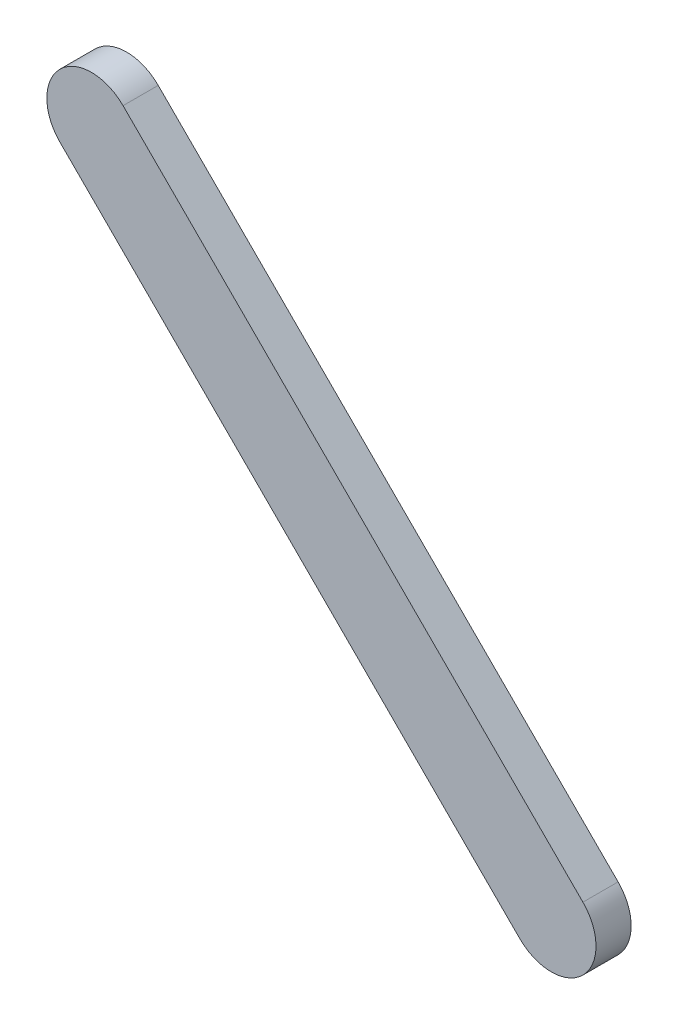
ISO-10303-21;
HEADER;
FILE_DESCRIPTION(('STEP AP214'),'2;1');
FILE_NAME('part.step','',(''),(''),'','','');
FILE_SCHEMA(('AUTOMOTIVE_DESIGN { 1 0 10303 214 1 1 1 1 }'));
ENDSEC;
DATA;
#1=APPLICATION_CONTEXT('core data for automotive mechanical design processes');
#2=APPLICATION_PROTOCOL_DEFINITION('international standard','automotive_design',2000,#1);
#3=PRODUCT_CONTEXT('',#1,'mechanical');
#4=PRODUCT('Part','Part','',(#3));
#5=PRODUCT_RELATED_PRODUCT_CATEGORY('part','',(#4));
#6=PRODUCT_DEFINITION_FORMATION('','',#4);
#7=PRODUCT_DEFINITION_CONTEXT('part definition',#1,'design');
#8=PRODUCT_DEFINITION('design','',#6,#7);
#9=PRODUCT_DEFINITION_SHAPE('','',#8);
#10=(LENGTH_UNIT() NAMED_UNIT(*) SI_UNIT(.MILLI.,.METRE.));
#11=(NAMED_UNIT(*) PLANE_ANGLE_UNIT() SI_UNIT($,.RADIAN.));
#12=(NAMED_UNIT(*) SI_UNIT($,.STERADIAN.) SOLID_ANGLE_UNIT());
#13=UNCERTAINTY_MEASURE_WITH_UNIT(LENGTH_MEASURE(1.E-05),#10,'distance_accuracy_value','');
#14=(GEOMETRIC_REPRESENTATION_CONTEXT(3) GLOBAL_UNCERTAINTY_ASSIGNED_CONTEXT((#13)) GLOBAL_UNIT_ASSIGNED_CONTEXT((#10,
#11,#12)) REPRESENTATION_CONTEXT('',''));
#15=CARTESIAN_POINT('',(0.,0.,0.));
#16=DIRECTION('',(0.,0.,1.));
#17=DIRECTION('',(1.,0.,0.));
#18=AXIS2_PLACEMENT_3D('',#15,#16,#17);
#19=CARTESIAN_POINT('',(151.63619406,121.30859406,0.));
#20=DIRECTION('',(0.70710678118655,0.707106781186546,0.));
#21=DIRECTION('',(0.707106781186546,-0.70710678118655,0.));
#22=AXIS2_PLACEMENT_3D('',#19,#20,#21);
#23=PLANE('',#22);
#24=DIRECTION('',(0.707106781186546,-0.707106781186549,0.));
#25=VECTOR('',#24,1.);
#26=CARTESIAN_POINT('',(151.63619406,121.30859406,0.1999996));
#27=LINE('',#26,#25);
#28=CARTESIAN_POINT('',(151.63619406,121.30859406,0.1999996));
#29=VERTEX_POINT('',#28);
#30=CARTESIAN_POINT('',(154.25239406,118.69239406,0.1999996));
#31=VERTEX_POINT('',#30);
#32=EDGE_CURVE('E11',#29,#31,#27,.T.);
#33=ORIENTED_EDGE('',*,*,#32,.F.);
#34=DIRECTION('',(0.,0.,1.));
#35=VECTOR('',#34,1.);
#36=CARTESIAN_POINT('',(151.63619406,121.30859406,0.));
#37=LINE('',#36,#35);
#38=CARTESIAN_POINT('',(151.63619406,121.30859406,0.));
#39=VERTEX_POINT('',#38);
#40=EDGE_CURVE('E24',#39,#29,#37,.T.);
#41=ORIENTED_EDGE('',*,*,#40,.F.);
#42=DIRECTION('',(0.707106781186546,-0.707106781186549,0.));
#43=VECTOR('',#42,1.);
#44=CARTESIAN_POINT('',(151.63619406,121.30859406,0.));
#45=LINE('',#44,#43);
#46=CARTESIAN_POINT('',(154.25239406,118.69239406,0.));
#47=VERTEX_POINT('',#46);
#48=EDGE_CURVE('E75',#39,#47,#45,.T.);
#49=ORIENTED_EDGE('',*,*,#48,.T.);
#50=DIRECTION('',(0.,0.,1.));
#51=VECTOR('',#50,1.);
#52=CARTESIAN_POINT('',(154.25239406,118.69239406,0.));
#53=LINE('',#52,#51);
#54=EDGE_CURVE('E37',#47,#31,#53,.T.);
#55=ORIENTED_EDGE('',*,*,#54,.T.);
#56=EDGE_LOOP('',(#33,#41,#49,#55));
#57=FACE_BOUND('',#56,.T.);
#58=ADVANCED_FACE('F17',(#57),#23,.F.);
#59=CARTESIAN_POINT('',(154.432,118.872,0.));
#60=DIRECTION('',(0.,0.,-1.));
#61=DIRECTION('',(-0.707106781186576,-0.70710678118652,0.));
#62=AXIS2_PLACEMENT_3D('',#59,#60,#61);
#63=CYLINDRICAL_SURFACE('',#62,0.254001156230781);
#64=CARTESIAN_POINT('',(154.432,118.872,0.1999996));
#65=DIRECTION('',(0.,0.,1.));
#66=DIRECTION('',(-0.707106781186576,-0.70710678118652,0.));
#67=AXIS2_PLACEMENT_3D('',#64,#65,#66);
#68=CIRCLE('',#67,0.254001156230781);
#69=CARTESIAN_POINT('',(154.61160594,119.05160594,0.1999996));
#70=VERTEX_POINT('',#69);
#71=EDGE_CURVE('E83',#31,#70,#68,.T.);
#72=ORIENTED_EDGE('',*,*,#71,.F.);
#73=ORIENTED_EDGE('',*,*,#54,.F.);
#74=CARTESIAN_POINT('',(154.432,118.872,0.));
#75=DIRECTION('',(0.,0.,1.));
#76=DIRECTION('',(-0.707106781186576,-0.70710678118652,0.));
#77=AXIS2_PLACEMENT_3D('',#74,#75,#76);
#78=CIRCLE('',#77,0.254001156230781);
#79=CARTESIAN_POINT('',(154.61160594,119.05160594,0.));
#80=VERTEX_POINT('',#79);
#81=EDGE_CURVE('E81',#47,#80,#78,.T.);
#82=ORIENTED_EDGE('',*,*,#81,.T.);
#83=DIRECTION('',(0.,0.,1.));
#84=VECTOR('',#83,1.);
#85=CARTESIAN_POINT('',(154.61160594,119.05160594,0.));
#86=LINE('',#85,#84);
#87=EDGE_CURVE('E67',#80,#70,#86,.T.);
#88=ORIENTED_EDGE('',*,*,#87,.T.);
#89=EDGE_LOOP('',(#72,#73,#82,#88));
#90=FACE_BOUND('',#89,.T.);
#91=ADVANCED_FACE('F89',(#90),#63,.T.);
#92=CARTESIAN_POINT('',(154.61160594,119.05160594,0.));
#93=DIRECTION('',(-0.707106781186546,-0.70710678118655,0.));
#94=DIRECTION('',(-0.70710678118655,0.707106781186546,0.));
#95=AXIS2_PLACEMENT_3D('',#92,#93,#94);
#96=PLANE('',#95);
#97=DIRECTION('',(-0.70710678118655,0.707106781186546,0.));
#98=VECTOR('',#97,1.);
#99=CARTESIAN_POINT('',(154.61160594,119.05160594,0.1999996));
#100=LINE('',#99,#98);
#101=CARTESIAN_POINT('',(151.99540594,121.66780594,0.1999996));
#102=VERTEX_POINT('',#101);
#103=EDGE_CURVE('E71',#70,#102,#100,.T.);
#104=ORIENTED_EDGE('',*,*,#103,.F.);
#105=ORIENTED_EDGE('',*,*,#87,.F.);
#106=DIRECTION('',(-0.70710678118655,0.707106781186546,0.));
#107=VECTOR('',#106,1.);
#108=CARTESIAN_POINT('',(154.61160594,119.05160594,0.));
#109=LINE('',#108,#107);
#110=CARTESIAN_POINT('',(151.99540594,121.66780594,0.));
#111=VERTEX_POINT('',#110);
#112=EDGE_CURVE('E63',#80,#111,#109,.T.);
#113=ORIENTED_EDGE('',*,*,#112,.T.);
#114=DIRECTION('',(0.,0.,1.));
#115=VECTOR('',#114,1.);
#116=CARTESIAN_POINT('',(151.99540594,121.66780594,0.));
#117=LINE('',#116,#115);
#118=EDGE_CURVE('E53',#111,#102,#117,.T.);
#119=ORIENTED_EDGE('',*,*,#118,.T.);
#120=EDGE_LOOP('',(#104,#105,#113,#119));
#121=FACE_BOUND('',#120,.T.);
#122=ADVANCED_FACE('F66',(#121),#96,.F.);
#123=CARTESIAN_POINT('',(151.8158,121.4882,0.));
#124=DIRECTION('',(0.,0.,-1.));
#125=DIRECTION('',(0.707106781186576,0.70710678118652,0.));
#126=AXIS2_PLACEMENT_3D('',#123,#124,#125);
#127=CYLINDRICAL_SURFACE('',#126,0.254001156230768);
#128=CARTESIAN_POINT('',(151.8158,121.4882,0.1999996));
#129=DIRECTION('',(0.,0.,1.));
#130=DIRECTION('',(0.707106781186576,0.70710678118652,0.));
#131=AXIS2_PLACEMENT_3D('',#128,#129,#130);
#132=CIRCLE('',#131,0.254001156230768);
#133=EDGE_CURVE('E59',#102,#29,#132,.T.);
#134=ORIENTED_EDGE('',*,*,#133,.F.);
#135=ORIENTED_EDGE('',*,*,#118,.F.);
#136=CARTESIAN_POINT('',(151.8158,121.4882,0.));
#137=DIRECTION('',(0.,0.,1.));
#138=DIRECTION('',(0.707106781186576,0.70710678118652,0.));
#139=AXIS2_PLACEMENT_3D('',#136,#137,#138);
#140=CIRCLE('',#139,0.254001156230768);
#141=EDGE_CURVE('E57',#111,#39,#140,.T.);
#142=ORIENTED_EDGE('',*,*,#141,.T.);
#143=ORIENTED_EDGE('',*,*,#40,.T.);
#144=EDGE_LOOP('',(#134,#135,#142,#143));
#145=FACE_BOUND('',#144,.T.);
#146=ADVANCED_FACE('F55',(#145),#127,.T.);
#147=CARTESIAN_POINT('',(151.63619406,121.30859406,0.));
#148=DIRECTION('',(0.,0.,-1.));
#149=DIRECTION('',(-1.,0.,0.));
#150=AXIS2_PLACEMENT_3D('',#147,#148,#149);
#151=PLANE('',#150);
#152=ORIENTED_EDGE('',*,*,#141,.F.);
#153=ORIENTED_EDGE('',*,*,#112,.F.);
#154=ORIENTED_EDGE('',*,*,#81,.F.);
#155=ORIENTED_EDGE('',*,*,#48,.F.);
#156=EDGE_LOOP('',(#152,#153,#154,#155));
#157=FACE_BOUND('',#156,.T.);
#158=ADVANCED_FACE('F74',(#157),#151,.T.);
#159=CARTESIAN_POINT('',(151.63619406,121.30859406,0.1999996));
#160=DIRECTION('',(0.,0.,-1.));
#161=DIRECTION('',(-1.,0.,0.));
#162=AXIS2_PLACEMENT_3D('',#159,#160,#161);
#163=PLANE('',#162);
#164=ORIENTED_EDGE('',*,*,#32,.T.);
#165=ORIENTED_EDGE('',*,*,#71,.T.);
#166=ORIENTED_EDGE('',*,*,#103,.T.);
#167=ORIENTED_EDGE('',*,*,#133,.T.);
#168=EDGE_LOOP('',(#164,#165,#166,#167));
#169=FACE_BOUND('',#168,.T.);
#170=ADVANCED_FACE('F91',(#169),#163,.F.);
#171=CLOSED_SHELL('',(#58,#91,#122,#146,#158,#170));
#172=MANIFOLD_SOLID_BREP('B1',#171);
#173=ADVANCED_BREP_SHAPE_REPRESENTATION('',(#18,#172),#14);
#174=SHAPE_DEFINITION_REPRESENTATION(#9,#173);
ENDSEC;
END-ISO-10303-21;
